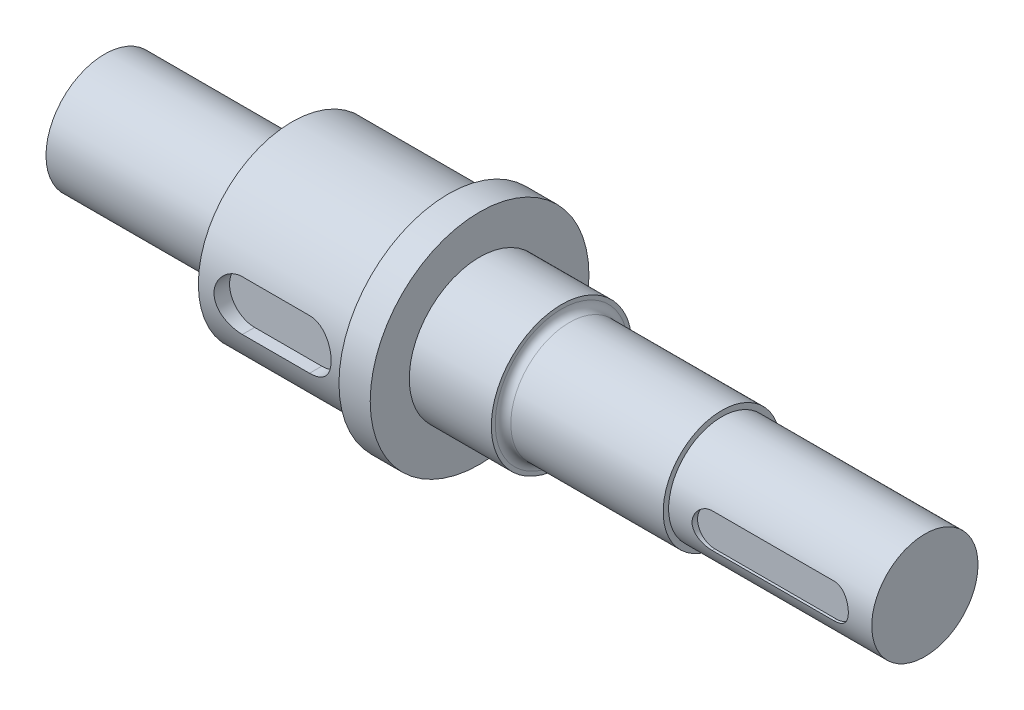
ISO-10303-21;
HEADER;
FILE_DESCRIPTION(('STEP AP214'),'2;1');
FILE_NAME('part.step','',(''),(''),'','','');
FILE_SCHEMA(('AUTOMOTIVE_DESIGN { 1 0 10303 214 1 1 1 1 }'));
ENDSEC;
DATA;
#1=APPLICATION_CONTEXT('core data for automotive mechanical design processes');
#2=APPLICATION_PROTOCOL_DEFINITION('international standard','automotive_design',2000,#1);
#3=PRODUCT_CONTEXT('',#1,'mechanical');
#4=PRODUCT('Part','Part','',(#3));
#5=PRODUCT_RELATED_PRODUCT_CATEGORY('part','',(#4));
#6=PRODUCT_DEFINITION_FORMATION('','',#4);
#7=PRODUCT_DEFINITION_CONTEXT('part definition',#1,'design');
#8=PRODUCT_DEFINITION('design','',#6,#7);
#9=PRODUCT_DEFINITION_SHAPE('','',#8);
#10=(LENGTH_UNIT() NAMED_UNIT(*) SI_UNIT(.MILLI.,.METRE.));
#11=(NAMED_UNIT(*) PLANE_ANGLE_UNIT() SI_UNIT($,.RADIAN.));
#12=(NAMED_UNIT(*) SI_UNIT($,.STERADIAN.) SOLID_ANGLE_UNIT());
#13=UNCERTAINTY_MEASURE_WITH_UNIT(LENGTH_MEASURE(1.E-05),#10,'distance_accuracy_value','');
#14=(GEOMETRIC_REPRESENTATION_CONTEXT(3) GLOBAL_UNCERTAINTY_ASSIGNED_CONTEXT((#13)) GLOBAL_UNIT_ASSIGNED_CONTEXT((#10,
#11,#12)) REPRESENTATION_CONTEXT('',''));
#15=CARTESIAN_POINT('',(0.,0.,0.));
#16=DIRECTION('',(0.,0.,1.));
#17=DIRECTION('',(1.,0.,0.));
#18=AXIS2_PLACEMENT_3D('',#15,#16,#17);
#19=CARTESIAN_POINT('',(395.,0.,0.));
#20=DIRECTION('',(1.,0.,0.));
#21=DIRECTION('',(0.,0.,-1.));
#22=AXIS2_PLACEMENT_3D('',#19,#20,#21);
#23=CYLINDRICAL_SURFACE('',#22,34.);
#24=CARTESIAN_POINT('',(525.,0.,0.));
#25=DIRECTION('',(1.,0.,0.));
#26=DIRECTION('',(0.,0.,-1.));
#27=AXIS2_PLACEMENT_3D('',#24,#25,#26);
#28=CIRCLE('',#27,34.);
#29=CARTESIAN_POINT('',(525.,0.,-34.));
#30=VERTEX_POINT('',#29);
#31=EDGE_CURVE('E118',#30,#30,#28,.T.);
#32=ORIENTED_EDGE('',*,*,#31,.F.);
#33=EDGE_LOOP('',(#32));
#34=FACE_BOUND('',#33,.T.);
#35=CARTESIAN_POINT('',(395.,0.,0.));
#36=DIRECTION('',(1.,0.,0.));
#37=DIRECTION('',(0.,0.,-1.));
#38=AXIS2_PLACEMENT_3D('',#35,#36,#37);
#39=CIRCLE('',#38,34.);
#40=CARTESIAN_POINT('',(395.,0.,-34.));
#41=VERTEX_POINT('',#40);
#42=EDGE_CURVE('E141',#41,#41,#39,.T.);
#43=ORIENTED_EDGE('',*,*,#42,.T.);
#44=EDGE_LOOP('',(#43));
#45=FACE_BOUND('',#44,.T.);
#46=DIRECTION('',(1.,0.,0.));
#47=VECTOR('',#46,1.);
#48=CARTESIAN_POINT('',(395.,-11.,32.1714158842908));
#49=LINE('',#48,#47);
#50=CARTESIAN_POINT('',(499.,-11.,32.1714158842908));
#51=VERTEX_POINT('',#50);
#52=CARTESIAN_POINT('',(421.,-11.,32.1714158842908));
#53=VERTEX_POINT('',#52);
#54=EDGE_CURVE('E246',#51,#53,#49,.F.);
#55=ORIENTED_EDGE('',*,*,#54,.T.);
#56=CARTESIAN_POINT('',(421.,-11.,32.1714158842908));
#57=CARTESIAN_POINT('',(420.699348415608,-11.0000421300015,32.1713684164739));
#58=CARTESIAN_POINT('',(420.398714543072,-10.9876758398141,32.1756288097998));
#59=CARTESIAN_POINT('',(419.799767189613,-10.9384394583162,32.1924181362032));
#60=CARTESIAN_POINT('',(419.50145313441,-10.9015756403414,32.2049449524064));
#61=CARTESIAN_POINT('',(418.910110257775,-10.8037951932587,32.2378737158662));
#62=CARTESIAN_POINT('',(418.617068891097,-10.7429467751487,32.2582533265139));
#63=CARTESIAN_POINT('',(418.037465596953,-10.5977654542974,32.3062415728782));
#64=CARTESIAN_POINT('',(417.750903883961,-10.5134317754358,32.3338504474994));
#65=CARTESIAN_POINT('',(417.186412321262,-10.3220787210714,32.3954435575253));
#66=CARTESIAN_POINT('',(416.90847622742,-10.2150762166256,32.4294230495076));
#67=CARTESIAN_POINT('',(416.362685724533,-9.97916519883595,32.5027924806916));
#68=CARTESIAN_POINT('',(416.094835173278,-9.85024840504397,32.5421844639537));
#69=CARTESIAN_POINT('',(415.570925960643,-9.57147930030023,32.6252651787711));
#70=CARTESIAN_POINT('',(415.314868605295,-9.42162467797678,32.6689543845482));
#71=CARTESIAN_POINT('',(414.815959180872,-9.10194816803727,32.7594587783757));
#72=CARTESIAN_POINT('',(414.573113264049,-8.93211709231556,32.80627540056));
#73=CARTESIAN_POINT('',(414.09430477111,-8.56766446877926,32.9033713994198));
#74=CARTESIAN_POINT('',(413.858839145264,-8.37240663238256,32.9537141478635));
#75=CARTESIAN_POINT('',(413.405145268139,-7.96313268056431,33.0549985753221));
#76=CARTESIAN_POINT('',(413.186909884627,-7.74912440485762,33.1059399963858));
#77=CARTESIAN_POINT('',(412.768794474262,-7.30346930581746,33.2071011251171));
#78=CARTESIAN_POINT('',(412.568925150587,-7.0718123393918,33.2573203977401));
#79=CARTESIAN_POINT('',(412.18905103687,-6.5924701101364,33.3556466969331));
#80=CARTESIAN_POINT('',(412.009038819513,-6.34479089560735,33.4037545091879));
#81=CARTESIAN_POINT('',(411.665839237403,-5.82853907321967,33.4977408217973));
#82=CARTESIAN_POINT('',(411.503176882268,-5.55960163581643,33.5435349775186));
#83=CARTESIAN_POINT('',(411.201173986328,-5.00817602070593,33.6302848885733));
#84=CARTESIAN_POINT('',(411.06183394159,-4.72568755493175,33.6712405409859));
#85=CARTESIAN_POINT('',(410.807673111435,-4.14917885105705,33.7471304453343));
#86=CARTESIAN_POINT('',(410.692846598574,-3.85516132569857,33.7820661034379));
#87=CARTESIAN_POINT('',(410.488708520836,-3.2576688251422,33.8449081542306));
#88=CARTESIAN_POINT('',(410.399395929704,-2.95419423088371,33.8728148296432));
#89=CARTESIAN_POINT('',(410.249644561998,-2.35020358794653,33.9199832108855));
#90=CARTESIAN_POINT('',(410.188352198834,-2.04991891710706,33.9394992218071));
#91=CARTESIAN_POINT('',(410.091003711756,-1.4448801245389,33.9706353654482));
#92=CARTESIAN_POINT('',(410.054947085141,-1.14012609196462,33.9822556554526));
#93=CARTESIAN_POINT('',(410.008426050069,-0.52852659766678,33.9972677189781));
#94=CARTESIAN_POINT('',(409.997956790247,-0.221681543466093,34.0006610523296));
#95=CARTESIAN_POINT('',(410.002700842862,0.391785701472856,33.9991261868652));
#96=CARTESIAN_POINT('',(410.017913598987,0.69840789689464,33.9941981683024));
#97=CARTESIAN_POINT('',(410.072830569147,1.29774768154693,33.9764976447594));
#98=CARTESIAN_POINT('',(410.111606846416,1.59055965726211,33.9640224291551));
#99=CARTESIAN_POINT('',(410.212479603219,2.17172312812994,33.9318185940098));
#100=CARTESIAN_POINT('',(410.274575404241,2.46007475280827,33.9120901855103));
#101=CARTESIAN_POINT('',(410.421548953685,3.03036080645826,33.8658938314507));
#102=CARTESIAN_POINT('',(410.506427278182,3.31229507296619,33.8394257154726));
#103=CARTESIAN_POINT('',(410.698263588497,3.86789420377519,33.7804299628029));
#104=CARTESIAN_POINT('',(410.805222042214,4.14155889269456,33.7479021977027));
#105=CARTESIAN_POINT('',(411.041859167954,4.68226554972603,33.6771683168277));
#106=CARTESIAN_POINT('',(411.171805708438,4.94918158521755,33.638896163862));
#107=CARTESIAN_POINT('',(411.452561610226,5.47122427122946,33.5579426145096));
#108=CARTESIAN_POINT('',(411.603378535766,5.72634660232683,33.5152596208904));
#109=CARTESIAN_POINT('',(411.924795901026,6.22319984778528,33.4265684070199));
#110=CARTESIAN_POINT('',(412.095396703549,6.4649305164461,33.3805601257943));
#111=CARTESIAN_POINT('',(412.455280976737,6.93361980004785,33.2863645776993));
#112=CARTESIAN_POINT('',(412.644565485665,7.16057759288861,33.2381771898165));
#113=CARTESIAN_POINT('',(413.04946711975,7.60815962548604,33.1386598895062));
#114=CARTESIAN_POINT('',(413.265880666638,7.82805412208243,33.0872854917123));
#115=CARTESIAN_POINT('',(413.716451962498,8.24893772149246,32.9848745551942));
#116=CARTESIAN_POINT('',(413.950610188801,8.44992631541234,32.9338380255988));
#117=CARTESIAN_POINT('',(414.435301258786,8.83175742476632,32.833504988362));
#118=CARTESIAN_POINT('',(414.685839628667,9.01259308493681,32.7842090766846));
#119=CARTESIAN_POINT('',(415.201656478533,9.35278873650189,32.6887834512547));
#120=CARTESIAN_POINT('',(415.46693432423,9.51214965101466,32.6426536014469));
#121=CARTESIAN_POINT('',(416.014250719464,9.8102350186424,32.5543206800736));
#122=CARTESIAN_POINT('',(416.296467672531,9.94865058429234,32.5121792868116));
#123=CARTESIAN_POINT('',(416.872302359272,10.2010237870103,32.4338800450692));
#124=CARTESIAN_POINT('',(417.165915325857,10.3149915234156,32.3977197272403));
#125=CARTESIAN_POINT('',(417.762233413963,10.5174091995707,32.332575190062));
#126=CARTESIAN_POINT('',(418.064928361899,10.6058865957161,32.3035832542476));
#127=CARTESIAN_POINT('',(418.677307181394,10.7566018580777,32.2537098047697));
#128=CARTESIAN_POINT('',(418.986987783682,10.8188517408941,32.2328245772202));
#129=CARTESIAN_POINT('',(419.580154349534,10.9116905733544,32.2015104656806));
#130=CARTESIAN_POINT('',(419.863204514437,10.9448004726003,32.1902522020657));
#131=CARTESIAN_POINT('',(420.430829293321,10.9889561367331,32.175191338866));
#132=CARTESIAN_POINT('',(420.715401322915,11.0000317288287,32.1713786605352));
#133=CARTESIAN_POINT('',(421.,11.,32.1714158842908));
#134=B_SPLINE_CURVE_WITH_KNOTS('',3,(#56,#57,#58,#59,#60,#61,#62,#63,#64,#65,#66,#67,#68,#69,
#70,#71,#72,#73,#74,#75,#76,#77,#78,#79,#80,#81,#82,#83,#84,#85,#86,#87,#88,#89,#90,#91,#92,#93,
#94,#95,#96,#97,#98,#99,#100,#101,#102,#103,#104,#105,#106,#107,#108,#109,#110,#111,#112,#113,
#114,#115,#116,#117,#118,#119,#120,#121,#122,#123,#124,#125,#126,#127,#128,#129,#130,#131,#132,
#133),.UNSPECIFIED.,.F.,.F.,(4,2,2,2,2,2,2,2,2,2,2,2,2,2,2,2,2,2,2,2,2,2,2,2,2,2,2,2,2,2,2,2,2,
2,2,2,2,2,4),(0.,0.901642960216828,1.80305511630478,2.7019219864904,3.60081856516817,
4.49904848418436,5.39761856238581,6.29628791414904,7.19537223427446,8.12433540723115,
9.05291200973431,9.9820263711519,10.9107920214899,11.8624841734173,12.8141965653303,
13.7656863512446,14.7171378596944,15.6372737486938,16.5573913078069,17.4773343990559,
18.3972575631994,19.2831102978502,20.1689372594392,21.0547866219988,21.9406547585391,
22.8376217928379,23.7349147783468,24.6322242212708,25.5295835562182,26.4668235045921,
27.4040886736161,28.3416716977692,29.2792144059051,30.2294609811907,31.1793142528131,
32.1281405512943,33.0765316542046,33.9311973238577,34.7847052677911),.UNSPECIFIED.);
#135=CARTESIAN_POINT('',(421.,11.,32.1714158842908));
#136=VERTEX_POINT('',#135);
#137=EDGE_CURVE('E115',#53,#136,#134,.T.);
#138=ORIENTED_EDGE('',*,*,#137,.T.);
#139=DIRECTION('',(1.,0.,0.));
#140=VECTOR('',#139,1.);
#141=CARTESIAN_POINT('',(395.,11.,32.1714158842908));
#142=LINE('',#141,#140);
#143=CARTESIAN_POINT('',(499.,11.,32.1714158842908));
#144=VERTEX_POINT('',#143);
#145=EDGE_CURVE('E232',#136,#144,#142,.T.);
#146=ORIENTED_EDGE('',*,*,#145,.T.);
#147=CARTESIAN_POINT('',(499.,11.,32.1714158842908));
#148=CARTESIAN_POINT('',(499.300651584392,11.0000421300014,32.171368416474));
#149=CARTESIAN_POINT('',(499.601285456927,10.9876758398141,32.1756288097998));
#150=CARTESIAN_POINT('',(500.200232810387,10.9384394583162,32.1924181362032));
#151=CARTESIAN_POINT('',(500.49854686559,10.9015756403414,32.2049449524065));
#152=CARTESIAN_POINT('',(501.089889742225,10.8037951932587,32.2378737158662));
#153=CARTESIAN_POINT('',(501.382931108903,10.7429467751487,32.2582533265139));
#154=CARTESIAN_POINT('',(501.962534403047,10.5977654542973,32.3062415728782));
#155=CARTESIAN_POINT('',(502.249096116039,10.5134317754357,32.3338504474994));
#156=CARTESIAN_POINT('',(502.813587678738,10.3220787210714,32.3954435575253));
#157=CARTESIAN_POINT('',(503.09152377258,10.2150762166256,32.4294230495076));
#158=CARTESIAN_POINT('',(503.637314275467,9.97916519883597,32.5027924806916));
#159=CARTESIAN_POINT('',(503.905164826722,9.85024840504398,32.5421844639537));
#160=CARTESIAN_POINT('',(504.429074039357,9.57147930030025,32.6252651787711));
#161=CARTESIAN_POINT('',(504.685131394705,9.42162467797682,32.6689543845482));
#162=CARTESIAN_POINT('',(505.184040819128,9.10194816803728,32.7594587783757));
#163=CARTESIAN_POINT('',(505.426886735951,8.93211709231552,32.80627540056));
#164=CARTESIAN_POINT('',(505.90569522889,8.56766446877919,32.9033713994198));
#165=CARTESIAN_POINT('',(506.141160854736,8.37240663238249,32.9537141478636));
#166=CARTESIAN_POINT('',(506.594854731861,7.96313268056426,33.0549985753221));
#167=CARTESIAN_POINT('',(506.813090115373,7.74912440485758,33.1059399963858));
#168=CARTESIAN_POINT('',(507.231205525738,7.30346930581742,33.2071011251171));
#169=CARTESIAN_POINT('',(507.431074849413,7.07181233939176,33.2573203977401));
#170=CARTESIAN_POINT('',(507.81094896313,6.59247011013631,33.3556466969331));
#171=CARTESIAN_POINT('',(507.990961180487,6.34479089560723,33.4037545091879));
#172=CARTESIAN_POINT('',(508.334160762597,5.82853907321952,33.4977408217974));
#173=CARTESIAN_POINT('',(508.496823117732,5.55960163581629,33.5435349775186));
#174=CARTESIAN_POINT('',(508.798826013672,5.00817602070579,33.6302848885733));
#175=CARTESIAN_POINT('',(508.93816605841,4.7256875549316,33.6712405409859));
#176=CARTESIAN_POINT('',(509.192326888565,4.14917885105692,33.7471304453343));
#177=CARTESIAN_POINT('',(509.307153401426,3.85516132569845,33.7820661034379));
#178=CARTESIAN_POINT('',(509.511291479164,3.2576688251421,33.8449081542306));
#179=CARTESIAN_POINT('',(509.600604070296,2.9541942308836,33.8728148296432));
#180=CARTESIAN_POINT('',(509.750355438002,2.35020358794642,33.9199832108855));
#181=CARTESIAN_POINT('',(509.811647801166,2.04991891710696,33.9394992218071));
#182=CARTESIAN_POINT('',(509.908996288244,1.4448801245388,33.9706353654482));
#183=CARTESIAN_POINT('',(509.945052914859,1.14012609196452,33.9822556554526));
#184=CARTESIAN_POINT('',(509.991573949931,0.528526597666673,33.9972677189781));
#185=CARTESIAN_POINT('',(510.002043209753,0.221681543465987,34.0006610523296));
#186=CARTESIAN_POINT('',(509.997299157138,-0.391785701472959,33.9991261868652));
#187=CARTESIAN_POINT('',(509.982086401013,-0.698407896894742,33.9941981683024));
#188=CARTESIAN_POINT('',(509.927169430853,-1.29774768154703,33.9764976447594));
#189=CARTESIAN_POINT('',(509.888393153584,-1.59055965726221,33.9640224291551));
#190=CARTESIAN_POINT('',(509.787520396781,-2.17172312813005,33.9318185940097));
#191=CARTESIAN_POINT('',(509.725424595759,-2.46007475280838,33.9120901855102));
#192=CARTESIAN_POINT('',(509.578451046315,-3.03036080645838,33.8658938314507));
#193=CARTESIAN_POINT('',(509.493572721818,-3.31229507296631,33.8394257154725));
#194=CARTESIAN_POINT('',(509.301736411503,-3.8678942037753,33.7804299628029));
#195=CARTESIAN_POINT('',(509.194777957786,-4.14155889269466,33.7479021977026));
#196=CARTESIAN_POINT('',(508.958140832046,-4.68226554972614,33.6771683168277));
#197=CARTESIAN_POINT('',(508.828194291562,-4.94918158521768,33.6388961638619));
#198=CARTESIAN_POINT('',(508.547438389774,-5.47122427122961,33.5579426145096));
#199=CARTESIAN_POINT('',(508.396621464234,-5.72634660232699,33.5152596208904));
#200=CARTESIAN_POINT('',(508.075204098974,-6.22319984778545,33.4265684070198));
#201=CARTESIAN_POINT('',(507.904603296451,-6.46493051644628,33.3805601257943));
#202=CARTESIAN_POINT('',(507.544719023263,-6.933619800048,33.2863645776992));
#203=CARTESIAN_POINT('',(507.355434514335,-7.16057759288874,33.2381771898165));
#204=CARTESIAN_POINT('',(506.95053288025,-7.60815962548616,33.1386598895061));
#205=CARTESIAN_POINT('',(506.734119333362,-7.82805412208256,33.0872854917122));
#206=CARTESIAN_POINT('',(506.283548037501,-8.24893772149258,32.9848745551941));
#207=CARTESIAN_POINT('',(506.049389811199,-8.44992631541245,32.9338380255987));
#208=CARTESIAN_POINT('',(505.564698741214,-8.83175742476642,32.8335049883619));
#209=CARTESIAN_POINT('',(505.314160371332,-9.01259308493688,32.7842090766846));
#210=CARTESIAN_POINT('',(504.798343521467,-9.35278873650194,32.6887834512547));
#211=CARTESIAN_POINT('',(504.53306567577,-9.51214965101472,32.6426536014469));
#212=CARTESIAN_POINT('',(503.985749280536,-9.81023501864246,32.5543206800736));
#213=CARTESIAN_POINT('',(503.703532327468,-9.94865058429239,32.5121792868116));
#214=CARTESIAN_POINT('',(503.127697640727,-10.2010237870104,32.4338800450692));
#215=CARTESIAN_POINT('',(502.834084674143,-10.3149915234157,32.3977197272403));
#216=CARTESIAN_POINT('',(502.237766586037,-10.5174091995708,32.332575190062));
#217=CARTESIAN_POINT('',(501.935071638101,-10.6058865957162,32.3035832542476));
#218=CARTESIAN_POINT('',(501.322692818606,-10.7566018580778,32.2537098047697));
#219=CARTESIAN_POINT('',(501.013012216318,-10.8188517408941,32.2328245772202));
#220=CARTESIAN_POINT('',(500.419845650466,-10.9116905733545,32.2015104656806));
#221=CARTESIAN_POINT('',(500.136795485562,-10.9448004726003,32.1902522020657));
#222=CARTESIAN_POINT('',(499.569170706679,-10.9889561367331,32.175191338866));
#223=CARTESIAN_POINT('',(499.284598677085,-11.0000317288288,32.1713786605352));
#224=CARTESIAN_POINT('',(499.,-11.,32.1714158842908));
#225=B_SPLINE_CURVE_WITH_KNOTS('',3,(#147,#148,#149,#150,#151,#152,#153,#154,#155,#156,#157,
#158,#159,#160,#161,#162,#163,#164,#165,#166,#167,#168,#169,#170,#171,#172,#173,#174,#175,#176,
#177,#178,#179,#180,#181,#182,#183,#184,#185,#186,#187,#188,#189,#190,#191,#192,#193,#194,#195,
#196,#197,#198,#199,#200,#201,#202,#203,#204,#205,#206,#207,#208,#209,#210,#211,#212,#213,#214,
#215,#216,#217,#218,#219,#220,#221,#222,#223,#224),.UNSPECIFIED.,.F.,.F.,(4,2,2,2,2,2,2,2,2,2,2,
2,2,2,2,2,2,2,2,2,2,2,2,2,2,2,2,2,2,2,2,2,2,2,2,2,2,2,4),(0.,0.901642960216883,1.80305511630489,
2.70192198649046,3.60081856516823,4.49904848418424,5.3976185623857,6.29628791414897,
7.19537223427449,8.12433540723117,9.05291200973432,9.98202637115196,10.9107920214901,
11.8624841734174,12.8141965653305,13.7656863512446,14.7171378596945,15.6372737486939,
16.557391307807,17.477334399056,18.3972575631995,19.2831102978503,20.1689372594393,
21.0547866219989,21.9406547585392,22.837621792838,23.734914778347,24.6322242212711,
25.5295835562183,26.4668235045923,27.4040886736162,28.3416716977694,29.2792144059051,
30.2294609811909,31.1793142528131,32.1281405512944,33.0765316542047,33.9311973238578,
34.7847052677911),.UNSPECIFIED.);
#226=EDGE_CURVE('E237',#144,#51,#225,.T.);
#227=ORIENTED_EDGE('',*,*,#226,.T.);
#228=EDGE_LOOP('',(#55,#138,#146,#227));
#229=FACE_BOUND('',#228,.T.);
#230=ADVANCED_FACE('F43',(#34,#45,#229),#23,.T.);
#231=CARTESIAN_POINT('',(40.0302022804443,0.,0.));
#232=DIRECTION('',(1.,0.,0.));
#233=DIRECTION('',(0.,0.,-1.));
#234=AXIS2_PLACEMENT_3D('',#231,#232,#233);
#235=CYLINDRICAL_SURFACE('',#234,37.5);
#236=CARTESIAN_POINT('',(297.5,0.,0.));
#237=DIRECTION('',(1.,0.,0.));
#238=DIRECTION('',(0.,0.,-1.));
#239=AXIS2_PLACEMENT_3D('',#236,#237,#238);
#240=CIRCLE('',#239,37.5);
#241=CARTESIAN_POINT('',(297.5,0.,-37.5));
#242=VERTEX_POINT('',#241);
#243=EDGE_CURVE('E13',#242,#242,#240,.T.);
#244=ORIENTED_EDGE('',*,*,#243,.T.);
#245=EDGE_LOOP('',(#244));
#246=FACE_BOUND('',#245,.T.);
#247=CARTESIAN_POINT('',(395.,0.,0.));
#248=DIRECTION('',(1.,0.,0.));
#249=DIRECTION('',(0.,0.,-1.));
#250=AXIS2_PLACEMENT_3D('',#247,#248,#249);
#251=CIRCLE('',#250,37.5);
#252=CARTESIAN_POINT('',(395.,0.,-37.5));
#253=VERTEX_POINT('',#252);
#254=EDGE_CURVE('E144',#253,#253,#251,.F.);
#255=ORIENTED_EDGE('',*,*,#254,.T.);
#256=EDGE_LOOP('',(#255));
#257=FACE_BOUND('',#256,.T.);
#258=ADVANCED_FACE('F288',(#246,#257),#235,.T.);
#259=CARTESIAN_POINT('',(0.,0.,0.));
#260=DIRECTION('',(1.,0.,0.));
#261=DIRECTION('',(0.,0.,-1.));
#262=AXIS2_PLACEMENT_3D('',#259,#260,#261);
#263=CYLINDRICAL_SURFACE('',#262,60.);
#264=CARTESIAN_POINT('',(220.,0.,0.));
#265=DIRECTION('',(1.,0.,0.));
#266=DIRECTION('',(0.,0.,-1.));
#267=AXIS2_PLACEMENT_3D('',#264,#265,#266);
#268=CIRCLE('',#267,60.);
#269=CARTESIAN_POINT('',(220.,0.,-60.));
#270=VERTEX_POINT('',#269);
#271=EDGE_CURVE('E170',#270,#270,#268,.T.);
#272=ORIENTED_EDGE('',*,*,#271,.F.);
#273=EDGE_LOOP('',(#272));
#274=FACE_BOUND('',#273,.T.);
#275=CARTESIAN_POINT('',(120.,0.,0.));
#276=DIRECTION('',(1.,0.,0.));
#277=DIRECTION('',(0.,0.,-1.));
#278=AXIS2_PLACEMENT_3D('',#275,#276,#277);
#279=CIRCLE('',#278,60.);
#280=CARTESIAN_POINT('',(120.,0.,-60.));
#281=VERTEX_POINT('',#280);
#282=EDGE_CURVE('E169',#281,#281,#279,.F.);
#283=ORIENTED_EDGE('',*,*,#282,.F.);
#284=EDGE_LOOP('',(#283));
#285=FACE_BOUND('',#284,.T.);
#286=DIRECTION('',(1.,0.,0.));
#287=VECTOR('',#286,1.);
#288=CARTESIAN_POINT('',(0.,-16.,57.8273291792038));
#289=LINE('',#288,#287);
#290=CARTESIAN_POINT('',(189.,-16.,57.8273291792038));
#291=VERTEX_POINT('',#290);
#292=CARTESIAN_POINT('',(146.,-16.,57.8273291792038));
#293=VERTEX_POINT('',#292);
#294=EDGE_CURVE('E199',#291,#293,#289,.F.);
#295=ORIENTED_EDGE('',*,*,#294,.T.);
#296=CARTESIAN_POINT('',(146.,-16.,57.8273291792038));
#297=CARTESIAN_POINT('',(145.779271137817,-16.0000002827331,57.8273272483985));
#298=CARTESIAN_POINT('',(145.558570129076,-15.9954315942681,57.8285934270961));
#299=CARTESIAN_POINT('',(145.117581507758,-15.9771727023908,57.8336414401654));
#300=CARTESIAN_POINT('',(144.897293882358,-15.963482786787,57.8374231951615));
#301=CARTESIAN_POINT('',(144.237742657043,-15.9087700042422,57.8525070776561));
#302=CARTESIAN_POINT('',(143.799613513935,-15.8541040728193,57.8675478547601));
#303=CARTESIAN_POINT('',(142.930785258483,-15.7090279559172,57.9070983194306));
#304=CARTESIAN_POINT('',(142.500072200665,-15.6186948483749,57.9315875859122));
#305=CARTESIAN_POINT('',(141.648076006089,-15.4030462925789,57.9892974033916));
#306=CARTESIAN_POINT('',(141.226793035094,-15.2777302299113,58.0225181077411));
#307=CARTESIAN_POINT('',(140.396668941283,-14.993170956642,58.0966988262622));
#308=CARTESIAN_POINT('',(139.987825020405,-14.833935441394,58.1376570847659));
#309=CARTESIAN_POINT('',(139.185170904398,-14.4827486558099,58.2261346787617));
#310=CARTESIAN_POINT('',(138.791361112257,-14.2907965092595,58.2736541899703));
#311=CARTESIAN_POINT('',(138.021201736111,-13.8755265163575,58.3739272131878));
#312=CARTESIAN_POINT('',(137.644857128119,-13.6521998031677,58.4266822035657));
#313=CARTESIAN_POINT('',(136.91209271716,-13.1757706996523,58.5359613998591));
#314=CARTESIAN_POINT('',(136.5556731996,-12.9226678829746,58.5924856597403));
#315=CARTESIAN_POINT('',(135.857192845575,-12.382356900343,58.7090733973865));
#316=CARTESIAN_POINT('',(135.515633917135,-12.0945106941921,58.7691878395633));
#317=CARTESIAN_POINT('',(134.857825382756,-11.4913481484857,58.890096803229));
#318=CARTESIAN_POINT('',(134.541576162412,-11.1760313905654,58.9508913350632));
#319=CARTESIAN_POINT('',(133.936396420609,-10.5199181440548,59.0715038868558));
#320=CARTESIAN_POINT('',(133.647470234682,-10.1791176270958,59.1313217505979));
#321=CARTESIAN_POINT('',(133.098926505429,-9.47426687512451,59.2483406817991));
#322=CARTESIAN_POINT('',(132.839309102534,-9.11021652872631,59.3055417367192));
#323=CARTESIAN_POINT('',(132.347270061471,-8.35519254896631,59.4166529936433));
#324=CARTESIAN_POINT('',(132.115352092484,-7.96388044890422,59.4704955991659));
#325=CARTESIAN_POINT('',(131.685394736336,-7.16232596869035,59.5723449222718));
#326=CARTESIAN_POINT('',(131.487355824977,-6.75208332277798,59.6203515578912));
#327=CARTESIAN_POINT('',(131.126770928941,-5.91560997863967,59.7091483436297));
#328=CARTESIAN_POINT('',(130.964218643894,-5.48938213423086,59.7499397745068));
#329=CARTESIAN_POINT('',(130.675931663192,-4.62395196607837,59.8231360970207));
#330=CARTESIAN_POINT('',(130.550195985576,-4.18474998872085,59.8555412123321));
#331=CARTESIAN_POINT('',(130.339089265986,-3.30681439454059,59.9103828506012));
#332=CARTESIAN_POINT('',(130.252860029885,-2.86830024986659,59.9330306070688));
#333=CARTESIAN_POINT('',(130.117353218784,-1.98521291748351,59.9687767601895));
#334=CARTESIAN_POINT('',(130.068075134614,-1.54063981335029,59.9818752884269));
#335=CARTESIAN_POINT('',(130.006913633946,-0.64880255299563,59.9981494746171));
#336=CARTESIAN_POINT('',(129.995025594356,-0.201538736319713,60.0013263593315));
#337=CARTESIAN_POINT('',(130.008738918263,0.69236929389725,59.9976698254868));
#338=CARTESIAN_POINT('',(130.034339747956,1.13901351617006,59.9908365494624));
#339=CARTESIAN_POINT('',(130.121678742147,2.0170866641595,59.9676527552883));
#340=CARTESIAN_POINT('',(130.18248751248,2.44861489387963,59.9515470633758));
#341=CARTESIAN_POINT('',(130.338987217271,3.30485769321631,59.9104467177624));
#342=CARTESIAN_POINT('',(130.434677463125,3.72957239716753,59.8854522395373));
#343=CARTESIAN_POINT('',(130.660159789005,4.56927785644547,59.827241676122));
#344=CARTESIAN_POINT('',(130.789952724345,4.98426836759998,59.7940253847256));
#345=CARTESIAN_POINT('',(131.082618029234,5.80174141369381,59.7202498839592));
#346=CARTESIAN_POINT('',(131.245490919298,6.20422375170169,59.6796905590474));
#347=CARTESIAN_POINT('',(131.604867249388,6.99798817190731,59.591855151533));
#348=CARTESIAN_POINT('',(131.801688603601,7.38911933437903,59.5445163664229));
#349=CARTESIAN_POINT('',(132.226384197219,8.15344444267676,59.4446794088113));
#350=CARTESIAN_POINT('',(132.454258553834,8.52663832079048,59.3921812168357));
#351=CARTESIAN_POINT('',(132.939515212395,9.25280839732829,59.2833902991447));
#352=CARTESIAN_POINT('',(133.196901657581,9.60578174650824,59.2270970410932));
#353=CARTESIAN_POINT('',(133.739455662963,10.2892883875041,59.1121871564033));
#354=CARTESIAN_POINT('',(134.024623894319,10.6198211368648,59.0535704736551));
#355=CARTESIAN_POINT('',(134.630067529852,11.2661731207037,58.9337311922684));
#356=CARTESIAN_POINT('',(134.951150558261,11.5812319014567,58.8724837592354));
#357=CARTESIAN_POINT('',(135.618777857834,12.1832801261608,58.7508471241072));
#358=CARTESIAN_POINT('',(135.965322829659,12.4702687971733,58.6904579456839));
#359=CARTESIAN_POINT('',(136.681787964495,13.0143477265972,58.5722143795958));
#360=CARTESIAN_POINT('',(137.051714973999,13.2714291646947,58.5143607428387));
#361=CARTESIAN_POINT('',(137.622083503878,13.6330934543671,58.4307630459778));
#362=CARTESIAN_POINT('',(137.81479126837,13.7496579798945,58.4034269322029));
#363=CARTESIAN_POINT('',(138.205140639279,13.9746530803781,58.3499994681906));
#364=CARTESIAN_POINT('',(138.402783614991,14.0830813637138,58.3239084693949));
#365=CARTESIAN_POINT('',(139.005174574346,14.3971645371187,58.2474750941193));
#366=CARTESIAN_POINT('',(139.416943037184,14.5900684339177,58.1993341927907));
#367=CARTESIAN_POINT('',(140.256086088745,14.9403529831741,58.1103997549113));
#368=CARTESIAN_POINT('',(140.683460178368,15.0977347705507,58.0696059836306));
#369=CARTESIAN_POINT('',(141.333579348545,15.306086304487,58.0149017285728));
#370=CARTESIAN_POINT('',(141.551699089602,15.370894572646,57.9977540618058));
#371=CARTESIAN_POINT('',(141.990600638288,15.491174478321,57.965743185804));
#372=CARTESIAN_POINT('',(142.211381765835,15.5466484490776,57.9508794057599));
#373=CARTESIAN_POINT('',(142.877034191951,15.6988570544149,57.9099045726733));
#374=CARTESIAN_POINT('',(143.325466716247,15.7814592125373,57.8873885915438));
#375=CARTESIAN_POINT('',(144.145018279277,15.8964588115673,57.8559033073543));
#376=CARTESIAN_POINT('',(144.515192869247,15.935294628094,57.8452044373551));
#377=CARTESIAN_POINT('',(145.256894339893,15.987054979372,57.8309106311653));
#378=CARTESIAN_POINT('',(145.628418146252,16.000020495899,57.8273044593875));
#379=CARTESIAN_POINT('',(146.,16.,57.8273291792038));
#380=B_SPLINE_CURVE_WITH_KNOTS('',3,(#296,#297,#298,#299,#300,#301,#302,#303,#304,#305,#306,
#307,#308,#309,#310,#311,#312,#313,#314,#315,#316,#317,#318,#319,#320,#321,#322,#323,#324,#325,
#326,#327,#328,#329,#330,#331,#332,#333,#334,#335,#336,#337,#338,#339,#340,#341,#342,#343,#344,
#345,#346,#347,#348,#349,#350,#351,#352,#353,#354,#355,#356,#357,#358,#359,#360,#361,#362,#363,
#364,#365,#366,#367,#368,#369,#370,#371,#372,#373,#374,#375,#376,#377,#378,#379),.UNSPECIFIED.,
.F.,.F.,(4,2,2,2,2,2,2,2,2,2,2,2,2,2,2,2,2,2,2,2,2,2,2,2,2,2,2,2,2,2,2,2,2,2,2,2,2,2,2,2,2,4),
(0.,0.662080216868985,1.32413954364691,2.64772838322767,3.96847242290787,5.28923966058651,
6.60970757248243,7.93021085460764,9.25108808074743,10.5719842223012,11.9225309716105,
13.2730982927747,14.6238795592817,15.9746672976322,17.3471465485468,18.7196450731765,
20.0918997230325,21.4641177691955,22.8049207051317,24.1457051650314,25.4863238370733,
26.8269234202186,28.1336512193579,29.4403532234676,30.7470880034773,32.0538433465971,
33.3735757544084,34.6933131437477,36.0132360401699,37.3331908316459,38.6935635281061,
40.0539736732531,41.4147840221499,42.0952248540106,42.7758566222318,44.1458338483349,
45.5157672979409,46.200142113295,46.8843456044627,48.2519582430758,49.3681174195812,
50.4825070527728),.UNSPECIFIED.);
#381=CARTESIAN_POINT('',(146.,16.,57.8273291792038));
#382=VERTEX_POINT('',#381);
#383=EDGE_CURVE('E225',#293,#382,#380,.T.);
#384=ORIENTED_EDGE('',*,*,#383,.T.);
#385=DIRECTION('',(1.,0.,0.));
#386=VECTOR('',#385,1.);
#387=CARTESIAN_POINT('',(0.,16.,57.8273291792038));
#388=LINE('',#387,#386);
#389=CARTESIAN_POINT('',(189.,16.,57.8273291792038));
#390=VERTEX_POINT('',#389);
#391=EDGE_CURVE('E181',#382,#390,#388,.T.);
#392=ORIENTED_EDGE('',*,*,#391,.T.);
#393=CARTESIAN_POINT('',(189.,16.,57.8273291792038));
#394=CARTESIAN_POINT('',(189.220728862183,16.0000002827331,57.8273272483985));
#395=CARTESIAN_POINT('',(189.441429870924,15.9954315942681,57.8285934270961));
#396=CARTESIAN_POINT('',(189.882418492242,15.9771727023908,57.8336414401654));
#397=CARTESIAN_POINT('',(190.102706117642,15.963482786787,57.8374231951615));
#398=CARTESIAN_POINT('',(190.762257342957,15.9087700042422,57.8525070776561));
#399=CARTESIAN_POINT('',(191.200386486066,15.8541040728193,57.8675478547601));
#400=CARTESIAN_POINT('',(192.069214741517,15.7090279559172,57.9070983194306));
#401=CARTESIAN_POINT('',(192.499927799335,15.6186948483749,57.9315875859122));
#402=CARTESIAN_POINT('',(193.351923993911,15.4030462925788,57.9892974033916));
#403=CARTESIAN_POINT('',(193.773206964906,15.2777302299113,58.0225181077411));
#404=CARTESIAN_POINT('',(194.603331058717,14.993170956642,58.0966988262622));
#405=CARTESIAN_POINT('',(195.012174979595,14.833935441394,58.1376570847659));
#406=CARTESIAN_POINT('',(195.814829095602,14.4827486558099,58.2261346787617));
#407=CARTESIAN_POINT('',(196.208638887743,14.2907965092595,58.2736541899703));
#408=CARTESIAN_POINT('',(196.978798263889,13.8755265163575,58.3739272131878));
#409=CARTESIAN_POINT('',(197.355142871881,13.6521998031676,58.4266822035657));
#410=CARTESIAN_POINT('',(198.08790728284,13.1757706996522,58.5359613998591));
#411=CARTESIAN_POINT('',(198.4443268004,12.9226678829746,58.5924856597403));
#412=CARTESIAN_POINT('',(199.142807154426,12.382356900343,58.7090733973865));
#413=CARTESIAN_POINT('',(199.484366082865,12.0945106941921,58.7691878395633));
#414=CARTESIAN_POINT('',(200.142174617245,11.4913481484857,58.890096803229));
#415=CARTESIAN_POINT('',(200.458423837588,11.1760313905654,58.9508913350632));
#416=CARTESIAN_POINT('',(201.063603579391,10.5199181440548,59.0715038868558));
#417=CARTESIAN_POINT('',(201.352529765318,10.1791176270958,59.1313217505979));
#418=CARTESIAN_POINT('',(201.901073494571,9.47426687512449,59.2483406817991));
#419=CARTESIAN_POINT('',(202.160690897466,9.1102165287263,59.3055417367192));
#420=CARTESIAN_POINT('',(202.652729938529,8.3551925489663,59.4166529936433));
#421=CARTESIAN_POINT('',(202.884647907516,7.96388044890421,59.4704955991659));
#422=CARTESIAN_POINT('',(203.314605263664,7.16232596869035,59.5723449222718));
#423=CARTESIAN_POINT('',(203.512644175023,6.75208332277797,59.6203515578912));
#424=CARTESIAN_POINT('',(203.873229071059,5.91560997863965,59.7091483436297));
#425=CARTESIAN_POINT('',(204.035781356106,5.48938213423084,59.7499397745068));
#426=CARTESIAN_POINT('',(204.324068336808,4.62395196607835,59.8231360970207));
#427=CARTESIAN_POINT('',(204.449804014424,4.18474998872083,59.8555412123321));
#428=CARTESIAN_POINT('',(204.660910734014,3.30681439454058,59.9103828506012));
#429=CARTESIAN_POINT('',(204.747139970115,2.86830024986658,59.9330306070688));
#430=CARTESIAN_POINT('',(204.882646781216,1.98521291748351,59.9687767601895));
#431=CARTESIAN_POINT('',(204.931924865386,1.54063981335028,59.9818752884269));
#432=CARTESIAN_POINT('',(204.993086366054,0.648802552995617,59.9981494746171));
#433=CARTESIAN_POINT('',(205.004974405644,0.2015387363197,60.0013263593315));
#434=CARTESIAN_POINT('',(204.991261081737,-0.692369293897262,59.9976698254868));
#435=CARTESIAN_POINT('',(204.965660252044,-1.13901351617008,59.9908365494624));
#436=CARTESIAN_POINT('',(204.878321257853,-2.01708666415951,59.9676527552883));
#437=CARTESIAN_POINT('',(204.81751248752,-2.44861489387963,59.9515470633758));
#438=CARTESIAN_POINT('',(204.661012782729,-3.30485769321632,59.9104467177624));
#439=CARTESIAN_POINT('',(204.565322536875,-3.72957239716753,59.8854522395373));
#440=CARTESIAN_POINT('',(204.339840210995,-4.56927785644548,59.827241676122));
#441=CARTESIAN_POINT('',(204.210047275655,-4.98426836759999,59.7940253847256));
#442=CARTESIAN_POINT('',(203.917381970766,-5.80174141369383,59.7202498839592));
#443=CARTESIAN_POINT('',(203.754509080702,-6.20422375170171,59.6796905590474));
#444=CARTESIAN_POINT('',(203.395132750612,-6.99798817190732,59.591855151533));
#445=CARTESIAN_POINT('',(203.198311396399,-7.38911933437903,59.5445163664229));
#446=CARTESIAN_POINT('',(202.773615802781,-8.15344444267676,59.4446794088113));
#447=CARTESIAN_POINT('',(202.545741446166,-8.52663832079049,59.3921812168357));
#448=CARTESIAN_POINT('',(202.060484787606,-9.25280839732831,59.2833902991447));
#449=CARTESIAN_POINT('',(201.803098342419,-9.60578174650825,59.2270970410932));
#450=CARTESIAN_POINT('',(201.260544337037,-10.2892883875041,59.1121871564033));
#451=CARTESIAN_POINT('',(200.975376105681,-10.6198211368648,59.0535704736551));
#452=CARTESIAN_POINT('',(200.369932470148,-11.2661731207038,58.9337311922684));
#453=CARTESIAN_POINT('',(200.04884944174,-11.5812319014567,58.8724837592354));
#454=CARTESIAN_POINT('',(199.381222142166,-12.1832801261608,58.7508471241072));
#455=CARTESIAN_POINT('',(199.034677170341,-12.4702687971733,58.6904579456839));
#456=CARTESIAN_POINT('',(198.318212035505,-13.0143477265972,58.5722143795958));
#457=CARTESIAN_POINT('',(197.948285026001,-13.2714291646947,58.5143607428387));
#458=CARTESIAN_POINT('',(197.377916496122,-13.6330934543671,58.4307630459778));
#459=CARTESIAN_POINT('',(197.18520873163,-13.7496579798945,58.4034269322029));
#460=CARTESIAN_POINT('',(196.794859360721,-13.9746530803781,58.3499994681906));
#461=CARTESIAN_POINT('',(196.597216385009,-14.0830813637138,58.3239084693949));
#462=CARTESIAN_POINT('',(195.994825425654,-14.3971645371187,58.2474750941193));
#463=CARTESIAN_POINT('',(195.583056962816,-14.5900684339177,58.1993341927907));
#464=CARTESIAN_POINT('',(194.743913911255,-14.9403529831741,58.1103997549113));
#465=CARTESIAN_POINT('',(194.316539821632,-15.0977347705507,58.0696059836306));
#466=CARTESIAN_POINT('',(193.666420651455,-15.306086304487,58.0149017285728));
#467=CARTESIAN_POINT('',(193.448300910398,-15.370894572646,57.9977540618058));
#468=CARTESIAN_POINT('',(193.009399361712,-15.491174478321,57.965743185804));
#469=CARTESIAN_POINT('',(192.788618234165,-15.5466484490776,57.9508794057599));
#470=CARTESIAN_POINT('',(192.122965808049,-15.6988570544149,57.9099045726733));
#471=CARTESIAN_POINT('',(191.674533283753,-15.7814592125373,57.8873885915438));
#472=CARTESIAN_POINT('',(190.854981720723,-15.8964588115673,57.8559033073542));
#473=CARTESIAN_POINT('',(190.484807130753,-15.935294628094,57.8452044373551));
#474=CARTESIAN_POINT('',(189.743105660107,-15.987054979372,57.8309106311653));
#475=CARTESIAN_POINT('',(189.371581853749,-16.0000204958991,57.8273044593875));
#476=CARTESIAN_POINT('',(189.,-16.,57.8273291792038));
#477=B_SPLINE_CURVE_WITH_KNOTS('',3,(#393,#394,#395,#396,#397,#398,#399,#400,#401,#402,#403,
#404,#405,#406,#407,#408,#409,#410,#411,#412,#413,#414,#415,#416,#417,#418,#419,#420,#421,#422,
#423,#424,#425,#426,#427,#428,#429,#430,#431,#432,#433,#434,#435,#436,#437,#438,#439,#440,#441,
#442,#443,#444,#445,#446,#447,#448,#449,#450,#451,#452,#453,#454,#455,#456,#457,#458,#459,#460,
#461,#462,#463,#464,#465,#466,#467,#468,#469,#470,#471,#472,#473,#474,#475,#476),.UNSPECIFIED.,
.F.,.F.,(4,2,2,2,2,2,2,2,2,2,2,2,2,2,2,2,2,2,2,2,2,2,2,2,2,2,2,2,2,2,2,2,2,2,2,2,2,2,2,2,2,4),
(0.,0.662080216868985,1.32413954364688,2.64772838322765,3.96847242290784,5.28923966058651,
6.60970757248243,7.9302108546076,9.25108808074743,10.5719842223012,11.9225309716105,
13.2730982927747,14.6238795592817,15.9746672976321,17.3471465485467,18.7196450731765,
20.0918997230325,21.4641177691955,22.8049207051317,24.1457051650313,25.4863238370733,
26.8269234202186,28.1336512193578,29.4403532234675,30.7470880034773,32.0538433465971,
33.3735757544083,34.6933131437476,36.0132360401699,37.3331908316459,38.6935635281061,
40.0539736732531,41.4147840221498,42.0952248540106,42.7758566222317,44.1458338483349,
45.5157672979408,46.200142113295,46.8843456044626,48.2519582430758,49.3681174195811,
50.4825070527728),.UNSPECIFIED.);
#478=EDGE_CURVE('E190',#390,#291,#477,.T.);
#479=ORIENTED_EDGE('',*,*,#478,.T.);
#480=EDGE_LOOP('',(#295,#384,#392,#479));
#481=FACE_BOUND('',#480,.T.);
#482=ADVANCED_FACE('F201',(#274,#285,#481),#263,.T.);
#483=CARTESIAN_POINT('',(240.,0.,0.));
#484=DIRECTION('',(1.,0.,0.));
#485=DIRECTION('',(0.,0.,-1.));
#486=AXIS2_PLACEMENT_3D('',#483,#484,#485);
#487=CYLINDRICAL_SURFACE('',#486,45.);
#488=CARTESIAN_POINT('',(240.,0.,0.));
#489=DIRECTION('',(1.,0.,0.));
#490=DIRECTION('',(0.,0.,-1.));
#491=AXIS2_PLACEMENT_3D('',#488,#489,#490);
#492=CIRCLE('',#491,45.);
#493=CARTESIAN_POINT('',(240.,0.,-45.));
#494=VERTEX_POINT('',#493);
#495=EDGE_CURVE('E175',#494,#494,#492,.T.);
#496=ORIENTED_EDGE('',*,*,#495,.T.);
#497=EDGE_LOOP('',(#496));
#498=FACE_BOUND('',#497,.T.);
#499=CARTESIAN_POINT('',(292.5,0.,0.));
#500=DIRECTION('',(1.,0.,0.));
#501=DIRECTION('',(0.,0.,-1.));
#502=AXIS2_PLACEMENT_3D('',#499,#500,#501);
#503=CIRCLE('',#502,45.);
#504=CARTESIAN_POINT('',(292.5,0.,-45.));
#505=VERTEX_POINT('',#504);
#506=EDGE_CURVE('E174',#505,#505,#503,.F.);
#507=ORIENTED_EDGE('',*,*,#506,.T.);
#508=EDGE_LOOP('',(#507));
#509=FACE_BOUND('',#508,.T.);
#510=ADVANCED_FACE('F359',(#498,#509),#487,.T.);
#511=CARTESIAN_POINT('',(525.,0.,0.));
#512=DIRECTION('',(-1.,0.,0.));
#513=DIRECTION('',(0.,0.,1.));
#514=AXIS2_PLACEMENT_3D('',#511,#512,#513);
#515=CYLINDRICAL_SURFACE('',#514,70.);
#516=CARTESIAN_POINT('',(220.,0.,0.));
#517=DIRECTION('',(1.,0.,0.));
#518=DIRECTION('',(0.,0.,-1.));
#519=AXIS2_PLACEMENT_3D('',#516,#517,#518);
#520=CIRCLE('',#519,70.);
#521=CARTESIAN_POINT('',(220.,0.,-70.));
#522=VERTEX_POINT('',#521);
#523=EDGE_CURVE('E173',#522,#522,#520,.T.);
#524=ORIENTED_EDGE('',*,*,#523,.T.);
#525=EDGE_LOOP('',(#524));
#526=FACE_BOUND('',#525,.T.);
#527=CARTESIAN_POINT('',(240.,0.,0.));
#528=DIRECTION('',(1.,0.,0.));
#529=DIRECTION('',(0.,0.,-1.));
#530=AXIS2_PLACEMENT_3D('',#527,#528,#529);
#531=CIRCLE('',#530,70.);
#532=CARTESIAN_POINT('',(240.,0.,-70.));
#533=VERTEX_POINT('',#532);
#534=EDGE_CURVE('E178',#533,#533,#531,.T.);
#535=ORIENTED_EDGE('',*,*,#534,.F.);
#536=EDGE_LOOP('',(#535));
#537=FACE_BOUND('',#536,.T.);
#538=ADVANCED_FACE('F367',(#526,#537),#515,.T.);
#539=CARTESIAN_POINT('',(240.,0.,0.));
#540=DIRECTION('',(1.,0.,0.));
#541=DIRECTION('',(0.,0.,-1.));
#542=AXIS2_PLACEMENT_3D('',#539,#540,#541);
#543=PLANE('',#542);
#544=ORIENTED_EDGE('',*,*,#495,.F.);
#545=EDGE_LOOP('',(#544));
#546=FACE_BOUND('',#545,.T.);
#547=ORIENTED_EDGE('',*,*,#534,.T.);
#548=EDGE_LOOP('',(#547));
#549=FACE_BOUND('',#548,.T.);
#550=ADVANCED_FACE('F375',(#546,#549),#543,.T.);
#551=CARTESIAN_POINT('',(220.,0.,0.));
#552=DIRECTION('',(1.,0.,0.));
#553=DIRECTION('',(0.,0.,-1.));
#554=AXIS2_PLACEMENT_3D('',#551,#552,#553);
#555=PLANE('',#554);
#556=ORIENTED_EDGE('',*,*,#271,.T.);
#557=EDGE_LOOP('',(#556));
#558=FACE_BOUND('',#557,.T.);
#559=ORIENTED_EDGE('',*,*,#523,.F.);
#560=EDGE_LOOP('',(#559));
#561=FACE_BOUND('',#560,.T.);
#562=ADVANCED_FACE('F341',(#558,#561),#555,.F.);
#563=CARTESIAN_POINT('',(292.5,0.,0.));
#564=DIRECTION('',(1.,0.,0.));
#565=DIRECTION('',(0.,0.,-1.));
#566=AXIS2_PLACEMENT_3D('',#563,#564,#565);
#567=PLANE('',#566);
#568=CARTESIAN_POINT('',(292.5,0.,0.));
#569=DIRECTION('',(1.,0.,0.));
#570=DIRECTION('',(0.,0.,-1.));
#571=AXIS2_PLACEMENT_3D('',#568,#569,#570);
#572=CIRCLE('',#571,42.5);
#573=CARTESIAN_POINT('',(292.5,0.,-42.5));
#574=VERTEX_POINT('',#573);
#575=EDGE_CURVE('E51',#574,#574,#572,.F.);
#576=ORIENTED_EDGE('',*,*,#575,.T.);
#577=EDGE_LOOP('',(#576));
#578=FACE_BOUND('',#577,.T.);
#579=ORIENTED_EDGE('',*,*,#506,.F.);
#580=EDGE_LOOP('',(#579));
#581=FACE_BOUND('',#580,.T.);
#582=ADVANCED_FACE('F276',(#578,#581),#567,.T.);
#583=CARTESIAN_POINT('',(419.969797719556,0.,0.));
#584=DIRECTION('',(-1.,0.,0.));
#585=DIRECTION('',(0.,0.,1.));
#586=AXIS2_PLACEMENT_3D('',#583,#584,#585);
#587=CYLINDRICAL_SURFACE('',#586,37.5);
#588=CARTESIAN_POINT('',(115.,0.,0.));
#589=DIRECTION('',(1.,0.,0.));
#590=DIRECTION('',(0.,0.,-1.));
#591=AXIS2_PLACEMENT_3D('',#588,#589,#590);
#592=CIRCLE('',#591,37.5);
#593=CARTESIAN_POINT('',(115.,0.,-37.5));
#594=VERTEX_POINT('',#593);
#595=EDGE_CURVE('E268',#594,#594,#592,.F.);
#596=ORIENTED_EDGE('',*,*,#595,.T.);
#597=EDGE_LOOP('',(#596));
#598=FACE_BOUND('',#597,.T.);
#599=CARTESIAN_POINT('',(0.,0.,0.));
#600=DIRECTION('',(-1.,0.,0.));
#601=DIRECTION('',(0.,0.,1.));
#602=AXIS2_PLACEMENT_3D('',#599,#600,#601);
#603=CIRCLE('',#602,37.5);
#604=CARTESIAN_POINT('',(0.,0.,37.5));
#605=VERTEX_POINT('',#604);
#606=EDGE_CURVE('E166',#605,#605,#603,.T.);
#607=ORIENTED_EDGE('',*,*,#606,.F.);
#608=EDGE_LOOP('',(#607));
#609=FACE_BOUND('',#608,.T.);
#610=ADVANCED_FACE('F223',(#598,#609),#587,.T.);
#611=CARTESIAN_POINT('',(120.,0.,0.));
#612=DIRECTION('',(1.,0.,0.));
#613=DIRECTION('',(0.,0.,-1.));
#614=AXIS2_PLACEMENT_3D('',#611,#612,#613);
#615=PLANE('',#614);
#616=CARTESIAN_POINT('',(120.,0.,0.));
#617=DIRECTION('',(1.,0.,0.));
#618=DIRECTION('',(0.,0.,-1.));
#619=AXIS2_PLACEMENT_3D('',#616,#617,#618);
#620=CIRCLE('',#619,42.5);
#621=CARTESIAN_POINT('',(120.,0.,-42.5));
#622=VERTEX_POINT('',#621);
#623=EDGE_CURVE('E271',#622,#622,#620,.T.);
#624=ORIENTED_EDGE('',*,*,#623,.T.);
#625=EDGE_LOOP('',(#624));
#626=FACE_BOUND('',#625,.T.);
#627=ORIENTED_EDGE('',*,*,#282,.T.);
#628=EDGE_LOOP('',(#627));
#629=FACE_BOUND('',#628,.T.);
#630=ADVANCED_FACE('F315',(#626,#629),#615,.F.);
#631=CARTESIAN_POINT('',(0.,0.,0.));
#632=DIRECTION('',(1.,0.,0.));
#633=DIRECTION('',(0.,0.,-1.));
#634=AXIS2_PLACEMENT_3D('',#631,#632,#633);
#635=PLANE('',#634);
#636=ORIENTED_EDGE('',*,*,#606,.T.);
#637=EDGE_LOOP('',(#636));
#638=FACE_BOUND('',#637,.T.);
#639=ADVANCED_FACE('F221',(#638),#635,.F.);
#640=CARTESIAN_POINT('',(146.,0.,70.));
#641=DIRECTION('',(0.,0.,-1.));
#642=DIRECTION('',(-1.,0.,0.));
#643=AXIS2_PLACEMENT_3D('',#640,#641,#642);
#644=CYLINDRICAL_SURFACE('',#643,16.);
#645=DIRECTION('',(0.,0.,-1.));
#646=VECTOR('',#645,1.);
#647=CARTESIAN_POINT('',(146.,-16.,70.));
#648=LINE('',#647,#646);
#649=CARTESIAN_POINT('',(146.,-16.,50.));
#650=VERTEX_POINT('',#649);
#651=EDGE_CURVE('E164',#293,#650,#648,.T.);
#652=ORIENTED_EDGE('',*,*,#651,.T.);
#653=CARTESIAN_POINT('',(146.,0.,50.));
#654=DIRECTION('',(0.,0.,1.));
#655=DIRECTION('',(1.,0.,0.));
#656=AXIS2_PLACEMENT_3D('',#653,#654,#655);
#657=CIRCLE('',#656,16.);
#658=CARTESIAN_POINT('',(146.,16.,50.));
#659=VERTEX_POINT('',#658);
#660=EDGE_CURVE('E147',#659,#650,#657,.T.);
#661=ORIENTED_EDGE('',*,*,#660,.F.);
#662=DIRECTION('',(0.,0.,-1.));
#663=VECTOR('',#662,1.);
#664=CARTESIAN_POINT('',(146.,16.,70.));
#665=LINE('',#664,#663);
#666=EDGE_CURVE('E159',#382,#659,#665,.T.);
#667=ORIENTED_EDGE('',*,*,#666,.F.);
#668=ORIENTED_EDGE('',*,*,#383,.F.);
#669=EDGE_LOOP('',(#652,#661,#667,#668));
#670=FACE_BOUND('',#669,.T.);
#671=ADVANCED_FACE('F216',(#670),#644,.F.);
#672=CARTESIAN_POINT('',(146.,-16.,70.));
#673=DIRECTION('',(0.,1.,0.));
#674=DIRECTION('',(0.,0.,1.));
#675=AXIS2_PLACEMENT_3D('',#672,#673,#674);
#676=PLANE('',#675);
#677=DIRECTION('',(0.,0.,-1.));
#678=VECTOR('',#677,1.);
#679=CARTESIAN_POINT('',(189.,-16.,70.));
#680=LINE('',#679,#678);
#681=CARTESIAN_POINT('',(189.,-16.,50.));
#682=VERTEX_POINT('',#681);
#683=EDGE_CURVE('E162',#291,#682,#680,.T.);
#684=ORIENTED_EDGE('',*,*,#683,.T.);
#685=DIRECTION('',(1.,0.,0.));
#686=VECTOR('',#685,1.);
#687=CARTESIAN_POINT('',(146.,-16.,50.));
#688=LINE('',#687,#686);
#689=EDGE_CURVE('E150',#650,#682,#688,.T.);
#690=ORIENTED_EDGE('',*,*,#689,.F.);
#691=ORIENTED_EDGE('',*,*,#651,.F.);
#692=ORIENTED_EDGE('',*,*,#294,.F.);
#693=EDGE_LOOP('',(#684,#690,#691,#692));
#694=FACE_BOUND('',#693,.T.);
#695=ADVANCED_FACE('F211',(#694),#676,.T.);
#696=CARTESIAN_POINT('',(189.,0.,70.));
#697=DIRECTION('',(0.,0.,-1.));
#698=DIRECTION('',(-1.,0.,0.));
#699=AXIS2_PLACEMENT_3D('',#696,#697,#698);
#700=CYLINDRICAL_SURFACE('',#699,16.);
#701=DIRECTION('',(0.,0.,-1.));
#702=VECTOR('',#701,1.);
#703=CARTESIAN_POINT('',(189.,16.,70.));
#704=LINE('',#703,#702);
#705=CARTESIAN_POINT('',(189.,16.,50.));
#706=VERTEX_POINT('',#705);
#707=EDGE_CURVE('E66',#390,#706,#704,.T.);
#708=ORIENTED_EDGE('',*,*,#707,.T.);
#709=CARTESIAN_POINT('',(189.,0.,50.));
#710=DIRECTION('',(0.,0.,1.));
#711=DIRECTION('',(1.,0.,0.));
#712=AXIS2_PLACEMENT_3D('',#709,#710,#711);
#713=CIRCLE('',#712,16.);
#714=EDGE_CURVE('E153',#682,#706,#713,.T.);
#715=ORIENTED_EDGE('',*,*,#714,.F.);
#716=ORIENTED_EDGE('',*,*,#683,.F.);
#717=ORIENTED_EDGE('',*,*,#478,.F.);
#718=EDGE_LOOP('',(#708,#715,#716,#717));
#719=FACE_BOUND('',#718,.T.);
#720=ADVANCED_FACE('F205',(#719),#700,.F.);
#721=CARTESIAN_POINT('',(146.,16.,70.));
#722=DIRECTION('',(0.,-1.,0.));
#723=DIRECTION('',(0.,0.,-1.));
#724=AXIS2_PLACEMENT_3D('',#721,#722,#723);
#725=PLANE('',#724);
#726=ORIENTED_EDGE('',*,*,#666,.T.);
#727=DIRECTION('',(-1.,0.,0.));
#728=VECTOR('',#727,1.);
#729=CARTESIAN_POINT('',(146.,16.,50.));
#730=LINE('',#729,#728);
#731=EDGE_CURVE('E156',#706,#659,#730,.T.);
#732=ORIENTED_EDGE('',*,*,#731,.F.);
#733=ORIENTED_EDGE('',*,*,#707,.F.);
#734=ORIENTED_EDGE('',*,*,#391,.F.);
#735=EDGE_LOOP('',(#726,#732,#733,#734));
#736=FACE_BOUND('',#735,.T.);
#737=ADVANCED_FACE('F210',(#736),#725,.T.);
#738=CARTESIAN_POINT('',(146.,0.,50.));
#739=DIRECTION('',(0.,0.,1.));
#740=DIRECTION('',(1.,0.,0.));
#741=AXIS2_PLACEMENT_3D('',#738,#739,#740);
#742=PLANE('',#741);
#743=ORIENTED_EDGE('',*,*,#660,.T.);
#744=ORIENTED_EDGE('',*,*,#689,.T.);
#745=ORIENTED_EDGE('',*,*,#714,.T.);
#746=ORIENTED_EDGE('',*,*,#731,.T.);
#747=EDGE_LOOP('',(#743,#744,#745,#746));
#748=FACE_BOUND('',#747,.T.);
#749=ADVANCED_FACE('F424',(#748),#742,.T.);
#750=CARTESIAN_POINT('',(395.,0.,0.));
#751=DIRECTION('',(1.,0.,0.));
#752=DIRECTION('',(0.,0.,-1.));
#753=AXIS2_PLACEMENT_3D('',#750,#751,#752);
#754=PLANE('',#753);
#755=ORIENTED_EDGE('',*,*,#254,.F.);
#756=EDGE_LOOP('',(#755));
#757=FACE_BOUND('',#756,.T.);
#758=ORIENTED_EDGE('',*,*,#42,.F.);
#759=EDGE_LOOP('',(#758));
#760=FACE_BOUND('',#759,.T.);
#761=ADVANCED_FACE('F402',(#757,#760),#754,.T.);
#762=CARTESIAN_POINT('',(525.,0.,0.));
#763=DIRECTION('',(1.,0.,0.));
#764=DIRECTION('',(0.,0.,-1.));
#765=AXIS2_PLACEMENT_3D('',#762,#763,#764);
#766=PLANE('',#765);
#767=ORIENTED_EDGE('',*,*,#31,.T.);
#768=EDGE_LOOP('',(#767));
#769=FACE_BOUND('',#768,.T.);
#770=ADVANCED_FACE('F262',(#769),#766,.T.);
#771=CARTESIAN_POINT('',(421.,0.,70.));
#772=DIRECTION('',(0.,0.,-1.));
#773=DIRECTION('',(-1.,0.,0.));
#774=AXIS2_PLACEMENT_3D('',#771,#772,#773);
#775=CYLINDRICAL_SURFACE('',#774,11.);
#776=DIRECTION('',(0.,0.,-1.));
#777=VECTOR('',#776,1.);
#778=CARTESIAN_POINT('',(421.,-11.,70.));
#779=LINE('',#778,#777);
#780=CARTESIAN_POINT('',(421.,-11.,30.5));
#781=VERTEX_POINT('',#780);
#782=EDGE_CURVE('E108',#53,#781,#779,.T.);
#783=ORIENTED_EDGE('',*,*,#782,.T.);
#784=CARTESIAN_POINT('',(421.,0.,30.5));
#785=DIRECTION('',(0.,0.,1.));
#786=DIRECTION('',(1.,0.,0.));
#787=AXIS2_PLACEMENT_3D('',#784,#785,#786);
#788=CIRCLE('',#787,11.);
#789=CARTESIAN_POINT('',(421.,11.,30.5));
#790=VERTEX_POINT('',#789);
#791=EDGE_CURVE('E113',#790,#781,#788,.T.);
#792=ORIENTED_EDGE('',*,*,#791,.F.);
#793=DIRECTION('',(0.,0.,-1.));
#794=VECTOR('',#793,1.);
#795=CARTESIAN_POINT('',(421.,11.,70.));
#796=LINE('',#795,#794);
#797=EDGE_CURVE('E137',#136,#790,#796,.T.);
#798=ORIENTED_EDGE('',*,*,#797,.F.);
#799=ORIENTED_EDGE('',*,*,#137,.F.);
#800=EDGE_LOOP('',(#783,#792,#798,#799));
#801=FACE_BOUND('',#800,.T.);
#802=ADVANCED_FACE('F110',(#801),#775,.F.);
#803=CARTESIAN_POINT('',(421.,-11.,70.));
#804=DIRECTION('',(0.,1.,0.));
#805=DIRECTION('',(0.,0.,1.));
#806=AXIS2_PLACEMENT_3D('',#803,#804,#805);
#807=PLANE('',#806);
#808=DIRECTION('',(0.,0.,-1.));
#809=VECTOR('',#808,1.);
#810=CARTESIAN_POINT('',(499.,-11.,70.));
#811=LINE('',#810,#809);
#812=CARTESIAN_POINT('',(499.,-11.,30.5));
#813=VERTEX_POINT('',#812);
#814=EDGE_CURVE('E119',#51,#813,#811,.T.);
#815=ORIENTED_EDGE('',*,*,#814,.T.);
#816=DIRECTION('',(1.,0.,0.));
#817=VECTOR('',#816,1.);
#818=CARTESIAN_POINT('',(421.,-11.,30.5));
#819=LINE('',#818,#817);
#820=EDGE_CURVE('E122',#781,#813,#819,.T.);
#821=ORIENTED_EDGE('',*,*,#820,.F.);
#822=ORIENTED_EDGE('',*,*,#782,.F.);
#823=ORIENTED_EDGE('',*,*,#54,.F.);
#824=EDGE_LOOP('',(#815,#821,#822,#823));
#825=FACE_BOUND('',#824,.T.);
#826=ADVANCED_FACE('F123',(#825),#807,.T.);
#827=CARTESIAN_POINT('',(499.,0.,70.));
#828=DIRECTION('',(0.,0.,-1.));
#829=DIRECTION('',(-1.,0.,0.));
#830=AXIS2_PLACEMENT_3D('',#827,#828,#829);
#831=CYLINDRICAL_SURFACE('',#830,11.);
#832=DIRECTION('',(0.,0.,-1.));
#833=VECTOR('',#832,1.);
#834=CARTESIAN_POINT('',(499.,11.,70.));
#835=LINE('',#834,#833);
#836=CARTESIAN_POINT('',(499.,11.,30.5));
#837=VERTEX_POINT('',#836);
#838=EDGE_CURVE('E58',#144,#837,#835,.T.);
#839=ORIENTED_EDGE('',*,*,#838,.T.);
#840=CARTESIAN_POINT('',(499.,0.,30.5));
#841=DIRECTION('',(0.,0.,1.));
#842=DIRECTION('',(1.,0.,0.));
#843=AXIS2_PLACEMENT_3D('',#840,#841,#842);
#844=CIRCLE('',#843,11.);
#845=EDGE_CURVE('E128',#813,#837,#844,.T.);
#846=ORIENTED_EDGE('',*,*,#845,.F.);
#847=ORIENTED_EDGE('',*,*,#814,.F.);
#848=ORIENTED_EDGE('',*,*,#226,.F.);
#849=EDGE_LOOP('',(#839,#846,#847,#848));
#850=FACE_BOUND('',#849,.T.);
#851=ADVANCED_FACE('F251',(#850),#831,.F.);
#852=CARTESIAN_POINT('',(421.,11.,70.));
#853=DIRECTION('',(0.,-1.,0.));
#854=DIRECTION('',(0.,0.,-1.));
#855=AXIS2_PLACEMENT_3D('',#852,#853,#854);
#856=PLANE('',#855);
#857=ORIENTED_EDGE('',*,*,#797,.T.);
#858=DIRECTION('',(-1.,0.,0.));
#859=VECTOR('',#858,1.);
#860=CARTESIAN_POINT('',(421.,11.,30.5));
#861=LINE('',#860,#859);
#862=EDGE_CURVE('E132',#837,#790,#861,.T.);
#863=ORIENTED_EDGE('',*,*,#862,.F.);
#864=ORIENTED_EDGE('',*,*,#838,.F.);
#865=ORIENTED_EDGE('',*,*,#145,.F.);
#866=EDGE_LOOP('',(#857,#863,#864,#865));
#867=FACE_BOUND('',#866,.T.);
#868=ADVANCED_FACE('F256',(#867),#856,.T.);
#869=CARTESIAN_POINT('',(421.,0.,30.5));
#870=DIRECTION('',(0.,0.,1.));
#871=DIRECTION('',(1.,0.,0.));
#872=AXIS2_PLACEMENT_3D('',#869,#870,#871);
#873=PLANE('',#872);
#874=ORIENTED_EDGE('',*,*,#791,.T.);
#875=ORIENTED_EDGE('',*,*,#820,.T.);
#876=ORIENTED_EDGE('',*,*,#845,.T.);
#877=ORIENTED_EDGE('',*,*,#862,.T.);
#878=EDGE_LOOP('',(#874,#875,#876,#877));
#879=FACE_BOUND('',#878,.T.);
#880=ADVANCED_FACE('F131',(#879),#873,.T.);
#881=CARTESIAN_POINT('',(115.,0.,0.));
#882=DIRECTION('',(1.,0.,0.));
#883=DIRECTION('',(0.,0.,-1.));
#884=AXIS2_PLACEMENT_3D('',#881,#882,#883);
#885=TOROIDAL_SURFACE('',#884,42.5,5.);
#886=ORIENTED_EDGE('',*,*,#623,.F.);
#887=EDGE_LOOP('',(#886));
#888=FACE_BOUND('',#887,.T.);
#889=ORIENTED_EDGE('',*,*,#595,.F.);
#890=EDGE_LOOP('',(#889));
#891=FACE_BOUND('',#890,.T.);
#892=ADVANCED_FACE('F280',(#888,#891),#885,.F.);
#893=CARTESIAN_POINT('',(297.5,0.,0.));
#894=DIRECTION('',(1.,0.,0.));
#895=DIRECTION('',(0.,0.,-1.));
#896=AXIS2_PLACEMENT_3D('',#893,#894,#895);
#897=TOROIDAL_SURFACE('',#896,42.5,5.);
#898=ORIENTED_EDGE('',*,*,#243,.F.);
#899=EDGE_LOOP('',(#898));
#900=FACE_BOUND('',#899,.T.);
#901=ORIENTED_EDGE('',*,*,#575,.F.);
#902=EDGE_LOOP('',(#901));
#903=FACE_BOUND('',#902,.T.);
#904=ADVANCED_FACE('F45',(#900,#903),#897,.F.);
#905=CLOSED_SHELL('',(#230,#258,#482,#510,#538,#550,#562,#582,#610,#630,#639,#671,#695,#720,
#737,#749,#761,#770,#802,#826,#851,#868,#880,#892,#904));
#906=MANIFOLD_SOLID_BREP('B2',#905);
#907=ADVANCED_BREP_SHAPE_REPRESENTATION('',(#18,#906),#14);
#908=SHAPE_DEFINITION_REPRESENTATION(#9,#907);
ENDSEC;
END-ISO-10303-21;
